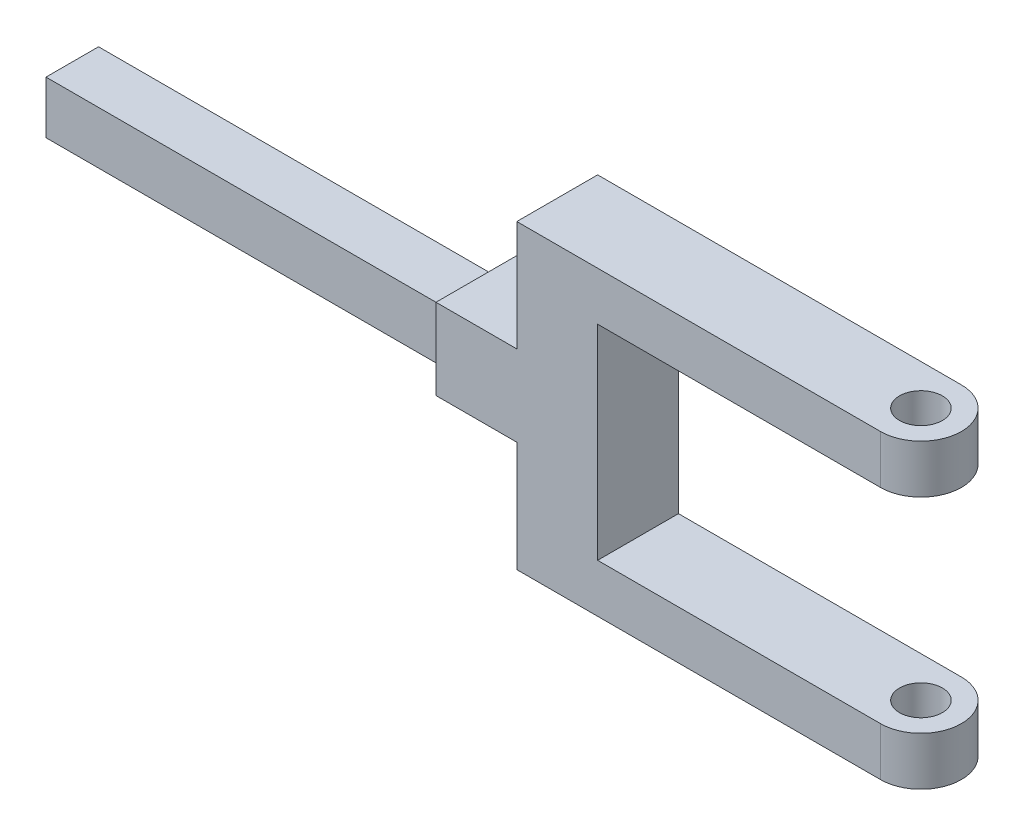
ISO-10303-21;
HEADER;
FILE_DESCRIPTION(('STEP AP214'),'2;1');
FILE_NAME('part.step','',(''),(''),'','','');
FILE_SCHEMA(('AUTOMOTIVE_DESIGN { 1 0 10303 214 1 1 1 1 }'));
ENDSEC;
DATA;
#1=APPLICATION_CONTEXT('core data for automotive mechanical design processes');
#2=APPLICATION_PROTOCOL_DEFINITION('international standard','automotive_design',2000,#1);
#3=PRODUCT_CONTEXT('',#1,'mechanical');
#4=PRODUCT('Part','Part','',(#3));
#5=PRODUCT_RELATED_PRODUCT_CATEGORY('part','',(#4));
#6=PRODUCT_DEFINITION_FORMATION('','',#4);
#7=PRODUCT_DEFINITION_CONTEXT('part definition',#1,'design');
#8=PRODUCT_DEFINITION('design','',#6,#7);
#9=PRODUCT_DEFINITION_SHAPE('','',#8);
#10=(LENGTH_UNIT() NAMED_UNIT(*) SI_UNIT(.MILLI.,.METRE.));
#11=(NAMED_UNIT(*) PLANE_ANGLE_UNIT() SI_UNIT($,.RADIAN.));
#12=(NAMED_UNIT(*) SI_UNIT($,.STERADIAN.) SOLID_ANGLE_UNIT());
#13=UNCERTAINTY_MEASURE_WITH_UNIT(LENGTH_MEASURE(1.E-05),#10,'distance_accuracy_value','');
#14=(GEOMETRIC_REPRESENTATION_CONTEXT(3) GLOBAL_UNCERTAINTY_ASSIGNED_CONTEXT((#13)) GLOBAL_UNIT_ASSIGNED_CONTEXT((#10,
#11,#12)) REPRESENTATION_CONTEXT('',''));
#15=CARTESIAN_POINT('',(0.,0.,0.));
#16=DIRECTION('',(0.,0.,1.));
#17=DIRECTION('',(1.,0.,0.));
#18=AXIS2_PLACEMENT_3D('',#15,#16,#17);
#19=CARTESIAN_POINT('',(40.,18.65,10.));
#20=DIRECTION('',(0.,-1.,0.));
#21=DIRECTION('',(1.,0.,0.));
#22=AXIS2_PLACEMENT_3D('',#19,#20,#21);
#23=PLANE('',#22);
#24=CARTESIAN_POINT('',(35.,18.65,5.));
#25=DIRECTION('',(0.,1.,0.));
#26=DIRECTION('',(-1.,0.,0.));
#27=AXIS2_PLACEMENT_3D('',#24,#25,#26);
#28=CIRCLE('',#27,2.65);
#29=CARTESIAN_POINT('',(32.35,18.65,5.));
#30=VERTEX_POINT('',#29);
#31=EDGE_CURVE('E349',#30,#30,#28,.T.);
#32=ORIENTED_EDGE('',*,*,#31,.F.);
#33=EDGE_LOOP('',(#32));
#34=FACE_BOUND('',#33,.T.);
#35=DIRECTION('',(-1.,0.,0.));
#36=VECTOR('',#35,1.);
#37=CARTESIAN_POINT('',(40.,18.65,10.));
#38=LINE('',#37,#36);
#39=CARTESIAN_POINT('',(35.,18.65,10.));
#40=VERTEX_POINT('',#39);
#41=CARTESIAN_POINT('',(-10.,18.65,10.));
#42=VERTEX_POINT('',#41);
#43=EDGE_CURVE('E240',#40,#42,#38,.T.);
#44=ORIENTED_EDGE('',*,*,#43,.F.);
#45=CARTESIAN_POINT('',(35.,18.65,5.));
#46=DIRECTION('',(0.,1.,0.));
#47=DIRECTION('',(-1.,0.,0.));
#48=AXIS2_PLACEMENT_3D('',#45,#46,#47);
#49=CIRCLE('',#48,5.);
#50=CARTESIAN_POINT('',(35.,18.65,0.));
#51=VERTEX_POINT('',#50);
#52=EDGE_CURVE('E198',#40,#51,#49,.T.);
#53=ORIENTED_EDGE('',*,*,#52,.T.);
#54=DIRECTION('',(-1.,0.,0.));
#55=VECTOR('',#54,1.);
#56=CARTESIAN_POINT('',(40.,18.65,0.));
#57=LINE('',#56,#55);
#58=CARTESIAN_POINT('',(-10.,18.65,0.));
#59=VERTEX_POINT('',#58);
#60=EDGE_CURVE('E226',#51,#59,#57,.T.);
#61=ORIENTED_EDGE('',*,*,#60,.T.);
#62=DIRECTION('',(0.,0.,-1.));
#63=VECTOR('',#62,1.);
#64=CARTESIAN_POINT('',(-10.,18.65,10.));
#65=LINE('',#64,#63);
#66=EDGE_CURVE('E248',#42,#59,#65,.T.);
#67=ORIENTED_EDGE('',*,*,#66,.F.);
#68=EDGE_LOOP('',(#44,#53,#61,#67));
#69=FACE_BOUND('',#68,.T.);
#70=ADVANCED_FACE('F79',(#34,#69),#23,.F.);
#71=CARTESIAN_POINT('',(-10.,-18.65,10.));
#72=DIRECTION('',(0.,1.,0.));
#73=DIRECTION('',(-1.,0.,0.));
#74=AXIS2_PLACEMENT_3D('',#71,#72,#73);
#75=PLANE('',#74);
#76=CARTESIAN_POINT('',(35.,-18.65,5.));
#77=DIRECTION('',(0.,1.,0.));
#78=DIRECTION('',(-1.,0.,0.));
#79=AXIS2_PLACEMENT_3D('',#76,#77,#78);
#80=CIRCLE('',#79,2.65);
#81=CARTESIAN_POINT('',(32.35,-18.65,5.));
#82=VERTEX_POINT('',#81);
#83=EDGE_CURVE('E260',#82,#82,#80,.T.);
#84=ORIENTED_EDGE('',*,*,#83,.T.);
#85=EDGE_LOOP('',(#84));
#86=FACE_BOUND('',#85,.T.);
#87=CARTESIAN_POINT('',(35.,-18.65,5.));
#88=DIRECTION('',(0.,1.,0.));
#89=DIRECTION('',(-1.,0.,0.));
#90=AXIS2_PLACEMENT_3D('',#87,#88,#89);
#91=CIRCLE('',#90,5.);
#92=CARTESIAN_POINT('',(35.,-18.65,10.));
#93=VERTEX_POINT('',#92);
#94=CARTESIAN_POINT('',(35.,-18.65,0.));
#95=VERTEX_POINT('',#94);
#96=EDGE_CURVE('E93',#93,#95,#91,.T.);
#97=ORIENTED_EDGE('',*,*,#96,.F.);
#98=DIRECTION('',(1.,0.,0.));
#99=VECTOR('',#98,1.);
#100=CARTESIAN_POINT('',(-10.,-18.65,10.));
#101=LINE('',#100,#99);
#102=CARTESIAN_POINT('',(-10.,-18.65,10.));
#103=VERTEX_POINT('',#102);
#104=EDGE_CURVE('E194',#103,#93,#101,.T.);
#105=ORIENTED_EDGE('',*,*,#104,.F.);
#106=DIRECTION('',(0.,0.,-1.));
#107=VECTOR('',#106,1.);
#108=CARTESIAN_POINT('',(-10.,-18.65,10.));
#109=LINE('',#108,#107);
#110=CARTESIAN_POINT('',(-10.,-18.65,0.));
#111=VERTEX_POINT('',#110);
#112=EDGE_CURVE('E246',#103,#111,#109,.T.);
#113=ORIENTED_EDGE('',*,*,#112,.T.);
#114=DIRECTION('',(1.,0.,0.));
#115=VECTOR('',#114,1.);
#116=CARTESIAN_POINT('',(-10.,-18.65,0.));
#117=LINE('',#116,#115);
#118=EDGE_CURVE('E196',#111,#95,#117,.T.);
#119=ORIENTED_EDGE('',*,*,#118,.T.);
#120=EDGE_LOOP('',(#97,#105,#113,#119));
#121=FACE_BOUND('',#120,.T.);
#122=ADVANCED_FACE('F191',(#86,#121),#75,.F.);
#123=CARTESIAN_POINT('',(40.,-12.65,10.));
#124=DIRECTION('',(0.,-1.,0.));
#125=DIRECTION('',(1.,0.,0.));
#126=AXIS2_PLACEMENT_3D('',#123,#124,#125);
#127=PLANE('',#126);
#128=CARTESIAN_POINT('',(35.,-12.65,5.));
#129=DIRECTION('',(0.,-1.,0.));
#130=DIRECTION('',(1.,0.,0.));
#131=AXIS2_PLACEMENT_3D('',#128,#129,#130);
#132=CIRCLE('',#131,2.65);
#133=CARTESIAN_POINT('',(37.65,-12.65,5.));
#134=VERTEX_POINT('',#133);
#135=EDGE_CURVE('E253',#134,#134,#132,.T.);
#136=ORIENTED_EDGE('',*,*,#135,.T.);
#137=EDGE_LOOP('',(#136));
#138=FACE_BOUND('',#137,.T.);
#139=DIRECTION('',(-1.,0.,0.));
#140=VECTOR('',#139,1.);
#141=CARTESIAN_POINT('',(40.,-12.65,10.));
#142=LINE('',#141,#140);
#143=CARTESIAN_POINT('',(35.,-12.65,10.));
#144=VERTEX_POINT('',#143);
#145=CARTESIAN_POINT('',(0.,-12.65,10.));
#146=VERTEX_POINT('',#145);
#147=EDGE_CURVE('E212',#144,#146,#142,.T.);
#148=ORIENTED_EDGE('',*,*,#147,.F.);
#149=CARTESIAN_POINT('',(35.,-12.65,5.));
#150=DIRECTION('',(0.,-1.,0.));
#151=DIRECTION('',(1.,0.,0.));
#152=AXIS2_PLACEMENT_3D('',#149,#150,#151);
#153=CIRCLE('',#152,5.);
#154=CARTESIAN_POINT('',(35.,-12.65,0.));
#155=VERTEX_POINT('',#154);
#156=EDGE_CURVE('E204',#155,#144,#153,.T.);
#157=ORIENTED_EDGE('',*,*,#156,.F.);
#158=DIRECTION('',(-1.,0.,0.));
#159=VECTOR('',#158,1.);
#160=CARTESIAN_POINT('',(40.,-12.65,0.));
#161=LINE('',#160,#159);
#162=CARTESIAN_POINT('',(0.,-12.65,0.));
#163=VERTEX_POINT('',#162);
#164=EDGE_CURVE('E233',#155,#163,#161,.T.);
#165=ORIENTED_EDGE('',*,*,#164,.T.);
#166=DIRECTION('',(0.,0.,-1.));
#167=VECTOR('',#166,1.);
#168=CARTESIAN_POINT('',(0.,-12.65,10.));
#169=LINE('',#168,#167);
#170=EDGE_CURVE('E243',#146,#163,#169,.T.);
#171=ORIENTED_EDGE('',*,*,#170,.F.);
#172=EDGE_LOOP('',(#148,#157,#165,#171));
#173=FACE_BOUND('',#172,.T.);
#174=ADVANCED_FACE('F365',(#138,#173),#127,.F.);
#175=CARTESIAN_POINT('',(0.,12.65,10.));
#176=DIRECTION('',(0.,1.,0.));
#177=DIRECTION('',(0.,0.,1.));
#178=AXIS2_PLACEMENT_3D('',#175,#176,#177);
#179=PLANE('',#178);
#180=CARTESIAN_POINT('',(35.,12.65,5.));
#181=DIRECTION('',(0.,1.,0.));
#182=DIRECTION('',(0.,0.,1.));
#183=AXIS2_PLACEMENT_3D('',#180,#181,#182);
#184=CIRCLE('',#183,2.65);
#185=CARTESIAN_POINT('',(35.,12.65,7.65));
#186=VERTEX_POINT('',#185);
#187=EDGE_CURVE('E251',#186,#186,#184,.T.);
#188=ORIENTED_EDGE('',*,*,#187,.T.);
#189=EDGE_LOOP('',(#188));
#190=FACE_BOUND('',#189,.T.);
#191=CARTESIAN_POINT('',(35.,12.65,5.));
#192=DIRECTION('',(0.,1.,0.));
#193=DIRECTION('',(0.,0.,1.));
#194=AXIS2_PLACEMENT_3D('',#191,#192,#193);
#195=CIRCLE('',#194,5.);
#196=CARTESIAN_POINT('',(35.,12.65,10.));
#197=VERTEX_POINT('',#196);
#198=CARTESIAN_POINT('',(35.,12.65,0.));
#199=VERTEX_POINT('',#198);
#200=EDGE_CURVE('E101',#197,#199,#195,.T.);
#201=ORIENTED_EDGE('',*,*,#200,.F.);
#202=DIRECTION('',(1.,0.,0.));
#203=VECTOR('',#202,1.);
#204=CARTESIAN_POINT('',(0.,12.65,10.));
#205=LINE('',#204,#203);
#206=CARTESIAN_POINT('',(0.,12.65,10.));
#207=VERTEX_POINT('',#206);
#208=EDGE_CURVE('E222',#207,#197,#205,.T.);
#209=ORIENTED_EDGE('',*,*,#208,.F.);
#210=DIRECTION('',(0.,0.,-1.));
#211=VECTOR('',#210,1.);
#212=CARTESIAN_POINT('',(0.,12.65,10.));
#213=LINE('',#212,#211);
#214=CARTESIAN_POINT('',(0.,12.65,0.));
#215=VERTEX_POINT('',#214);
#216=EDGE_CURVE('E225',#207,#215,#213,.T.);
#217=ORIENTED_EDGE('',*,*,#216,.T.);
#218=DIRECTION('',(1.,0.,0.));
#219=VECTOR('',#218,1.);
#220=CARTESIAN_POINT('',(0.,12.65,0.));
#221=LINE('',#220,#219);
#222=EDGE_CURVE('E237',#215,#199,#221,.T.);
#223=ORIENTED_EDGE('',*,*,#222,.T.);
#224=EDGE_LOOP('',(#201,#209,#217,#223));
#225=FACE_BOUND('',#224,.T.);
#226=ADVANCED_FACE('F368',(#190,#225),#179,.F.);
#227=CARTESIAN_POINT('',(0.,0.,10.));
#228=DIRECTION('',(0.,0.,1.));
#229=DIRECTION('',(1.,0.,0.));
#230=AXIS2_PLACEMENT_3D('',#227,#228,#229);
#231=PLANE('',#230);
#232=ORIENTED_EDGE('',*,*,#104,.T.);
#233=DIRECTION('',(0.,1.,0.));
#234=VECTOR('',#233,1.);
#235=CARTESIAN_POINT('',(35.,-18.65,10.));
#236=LINE('',#235,#234);
#237=EDGE_CURVE('E201',#93,#144,#236,.T.);
#238=ORIENTED_EDGE('',*,*,#237,.T.);
#239=ORIENTED_EDGE('',*,*,#147,.T.);
#240=DIRECTION('',(0.,1.,0.));
#241=VECTOR('',#240,1.);
#242=CARTESIAN_POINT('',(0.,12.65,10.));
#243=LINE('',#242,#241);
#244=EDGE_CURVE('E215',#146,#207,#243,.T.);
#245=ORIENTED_EDGE('',*,*,#244,.T.);
#246=ORIENTED_EDGE('',*,*,#208,.T.);
#247=DIRECTION('',(0.,1.,0.));
#248=VECTOR('',#247,1.);
#249=CARTESIAN_POINT('',(35.,-18.65,10.));
#250=LINE('',#249,#248);
#251=EDGE_CURVE('E12',#197,#40,#250,.T.);
#252=ORIENTED_EDGE('',*,*,#251,.T.);
#253=ORIENTED_EDGE('',*,*,#43,.T.);
#254=DIRECTION('',(0.,-1.,0.));
#255=VECTOR('',#254,1.);
#256=CARTESIAN_POINT('',(-10.,18.65,10.));
#257=LINE('',#256,#255);
#258=CARTESIAN_POINT('',(-10.,5.,10.));
#259=VERTEX_POINT('',#258);
#260=EDGE_CURVE('E213',#42,#259,#257,.T.);
#261=ORIENTED_EDGE('',*,*,#260,.T.);
#262=DIRECTION('',(1.,0.,0.));
#263=VECTOR('',#262,1.);
#264=CARTESIAN_POINT('',(-20.,5.,10.));
#265=LINE('',#264,#263);
#266=CARTESIAN_POINT('',(-20.,5.,10.));
#267=VERTEX_POINT('',#266);
#268=EDGE_CURVE('E313',#267,#259,#265,.T.);
#269=ORIENTED_EDGE('',*,*,#268,.F.);
#270=DIRECTION('',(0.,1.,0.));
#271=VECTOR('',#270,1.);
#272=CARTESIAN_POINT('',(-20.,0.,10.));
#273=LINE('',#272,#271);
#274=CARTESIAN_POINT('',(-20.,-5.,10.));
#275=VERTEX_POINT('',#274);
#276=EDGE_CURVE('E302',#275,#267,#273,.T.);
#277=ORIENTED_EDGE('',*,*,#276,.F.);
#278=DIRECTION('',(1.,0.,0.));
#279=VECTOR('',#278,1.);
#280=CARTESIAN_POINT('',(-20.,-5.,10.));
#281=LINE('',#280,#279);
#282=CARTESIAN_POINT('',(-10.,-5.,10.));
#283=VERTEX_POINT('',#282);
#284=EDGE_CURVE('E316',#275,#283,#281,.T.);
#285=ORIENTED_EDGE('',*,*,#284,.T.);
#286=EDGE_CURVE('E210',#283,#103,#257,.T.);
#287=ORIENTED_EDGE('',*,*,#286,.T.);
#288=EDGE_LOOP('',(#232,#238,#239,#245,#246,#252,#253,#261,#269,#277,#285,#287));
#289=FACE_BOUND('',#288,.T.);
#290=ADVANCED_FACE('F208',(#289),#231,.T.);
#291=CARTESIAN_POINT('',(0.,0.,0.));
#292=DIRECTION('',(0.,0.,1.));
#293=DIRECTION('',(1.,0.,0.));
#294=AXIS2_PLACEMENT_3D('',#291,#292,#293);
#295=PLANE('',#294);
#296=DIRECTION('',(0.,1.,0.));
#297=VECTOR('',#296,1.);
#298=CARTESIAN_POINT('',(35.,-18.65,0.));
#299=LINE('',#298,#297);
#300=EDGE_CURVE('E197',#95,#155,#299,.T.);
#301=ORIENTED_EDGE('',*,*,#300,.F.);
#302=ORIENTED_EDGE('',*,*,#118,.F.);
#303=DIRECTION('',(0.,-1.,0.));
#304=VECTOR('',#303,1.);
#305=CARTESIAN_POINT('',(-10.,18.65,0.));
#306=LINE('',#305,#304);
#307=CARTESIAN_POINT('',(-10.,-5.,0.));
#308=VERTEX_POINT('',#307);
#309=EDGE_CURVE('E228',#308,#111,#306,.T.);
#310=ORIENTED_EDGE('',*,*,#309,.F.);
#311=DIRECTION('',(1.,0.,0.));
#312=VECTOR('',#311,1.);
#313=CARTESIAN_POINT('',(-20.,-5.,0.));
#314=LINE('',#313,#312);
#315=CARTESIAN_POINT('',(-20.,-5.,0.));
#316=VERTEX_POINT('',#315);
#317=EDGE_CURVE('E229',#316,#308,#314,.T.);
#318=ORIENTED_EDGE('',*,*,#317,.F.);
#319=DIRECTION('',(0.,-1.,0.));
#320=VECTOR('',#319,1.);
#321=CARTESIAN_POINT('',(-20.,0.,0.));
#322=LINE('',#321,#320);
#323=CARTESIAN_POINT('',(-20.,5.,0.));
#324=VERTEX_POINT('',#323);
#325=EDGE_CURVE('E296',#324,#316,#322,.T.);
#326=ORIENTED_EDGE('',*,*,#325,.F.);
#327=DIRECTION('',(1.,0.,0.));
#328=VECTOR('',#327,1.);
#329=CARTESIAN_POINT('',(-20.,5.,0.));
#330=LINE('',#329,#328);
#331=CARTESIAN_POINT('',(-10.,5.,0.));
#332=VERTEX_POINT('',#331);
#333=EDGE_CURVE('E307',#324,#332,#330,.T.);
#334=ORIENTED_EDGE('',*,*,#333,.T.);
#335=EDGE_CURVE('E230',#59,#332,#306,.T.);
#336=ORIENTED_EDGE('',*,*,#335,.F.);
#337=ORIENTED_EDGE('',*,*,#60,.F.);
#338=DIRECTION('',(0.,1.,0.));
#339=VECTOR('',#338,1.);
#340=CARTESIAN_POINT('',(35.,-18.65,0.));
#341=LINE('',#340,#339);
#342=EDGE_CURVE('E86',#199,#51,#341,.T.);
#343=ORIENTED_EDGE('',*,*,#342,.F.);
#344=ORIENTED_EDGE('',*,*,#222,.F.);
#345=DIRECTION('',(0.,1.,0.));
#346=VECTOR('',#345,1.);
#347=CARTESIAN_POINT('',(0.,12.65,0.));
#348=LINE('',#347,#346);
#349=EDGE_CURVE('E235',#163,#215,#348,.T.);
#350=ORIENTED_EDGE('',*,*,#349,.F.);
#351=ORIENTED_EDGE('',*,*,#164,.F.);
#352=EDGE_LOOP('',(#301,#302,#310,#318,#326,#334,#336,#337,#343,#344,#350,#351));
#353=FACE_BOUND('',#352,.T.);
#354=ADVANCED_FACE('F331',(#353),#295,.F.);
#355=CARTESIAN_POINT('',(-20.,0.,0.));
#356=DIRECTION('',(-1.,0.,0.));
#357=DIRECTION('',(0.,-1.,0.));
#358=AXIS2_PLACEMENT_3D('',#355,#356,#357);
#359=PLANE('',#358);
#360=ORIENTED_EDGE('',*,*,#325,.T.);
#361=DIRECTION('',(0.,0.,1.));
#362=VECTOR('',#361,1.);
#363=CARTESIAN_POINT('',(-20.,-5.,0.));
#364=LINE('',#363,#362);
#365=EDGE_CURVE('E299',#316,#275,#364,.T.);
#366=ORIENTED_EDGE('',*,*,#365,.T.);
#367=ORIENTED_EDGE('',*,*,#276,.T.);
#368=DIRECTION('',(0.,0.,1.));
#369=VECTOR('',#368,1.);
#370=CARTESIAN_POINT('',(-20.,5.,0.));
#371=LINE('',#370,#369);
#372=EDGE_CURVE('E304',#324,#267,#371,.T.);
#373=ORIENTED_EDGE('',*,*,#372,.F.);
#374=EDGE_LOOP('',(#360,#366,#367,#373));
#375=FACE_BOUND('',#374,.T.);
#376=DIRECTION('',(0.,1.,0.));
#377=VECTOR('',#376,1.);
#378=CARTESIAN_POINT('',(-20.,0.,8.25));
#379=LINE('',#378,#377);
#380=CARTESIAN_POINT('',(-20.,-3.25,8.25));
#381=VERTEX_POINT('',#380);
#382=CARTESIAN_POINT('',(-20.,3.25,8.25));
#383=VERTEX_POINT('',#382);
#384=EDGE_CURVE('E268',#381,#383,#379,.T.);
#385=ORIENTED_EDGE('',*,*,#384,.F.);
#386=DIRECTION('',(0.,0.,-1.));
#387=VECTOR('',#386,1.);
#388=CARTESIAN_POINT('',(-20.,-3.25000000000001,0.));
#389=LINE('',#388,#387);
#390=CARTESIAN_POINT('',(-20.,-3.25000000000001,1.75));
#391=VERTEX_POINT('',#390);
#392=EDGE_CURVE('E257',#381,#391,#389,.T.);
#393=ORIENTED_EDGE('',*,*,#392,.T.);
#394=DIRECTION('',(0.,1.,0.));
#395=VECTOR('',#394,1.);
#396=CARTESIAN_POINT('',(-20.,0.,1.75));
#397=LINE('',#396,#395);
#398=CARTESIAN_POINT('',(-20.,3.25,1.75));
#399=VERTEX_POINT('',#398);
#400=EDGE_CURVE('E277',#391,#399,#397,.T.);
#401=ORIENTED_EDGE('',*,*,#400,.T.);
#402=DIRECTION('',(0.,0.,-1.));
#403=VECTOR('',#402,1.);
#404=CARTESIAN_POINT('',(-20.,3.25,0.));
#405=LINE('',#404,#403);
#406=EDGE_CURVE('E279',#383,#399,#405,.T.);
#407=ORIENTED_EDGE('',*,*,#406,.F.);
#408=EDGE_LOOP('',(#385,#393,#401,#407));
#409=FACE_BOUND('',#408,.T.);
#410=ADVANCED_FACE('F340',(#375,#409),#359,.T.);
#411=CARTESIAN_POINT('',(-10.,18.65,10.));
#412=DIRECTION('',(1.,0.,0.));
#413=DIRECTION('',(0.,1.,0.));
#414=AXIS2_PLACEMENT_3D('',#411,#412,#413);
#415=PLANE('',#414);
#416=DIRECTION('',(0.,0.,1.));
#417=VECTOR('',#416,1.);
#418=CARTESIAN_POINT('',(-10.,-5.,0.));
#419=LINE('',#418,#417);
#420=EDGE_CURVE('E287',#308,#283,#419,.T.);
#421=ORIENTED_EDGE('',*,*,#420,.F.);
#422=ORIENTED_EDGE('',*,*,#309,.T.);
#423=ORIENTED_EDGE('',*,*,#112,.F.);
#424=ORIENTED_EDGE('',*,*,#286,.F.);
#425=EDGE_LOOP('',(#421,#422,#423,#424));
#426=FACE_BOUND('',#425,.T.);
#427=ADVANCED_FACE('F346',(#426),#415,.F.);
#428=ORIENTED_EDGE('',*,*,#335,.T.);
#429=DIRECTION('',(0.,0.,1.));
#430=VECTOR('',#429,1.);
#431=CARTESIAN_POINT('',(-10.,5.,0.));
#432=LINE('',#431,#430);
#433=EDGE_CURVE('E300',#332,#259,#432,.T.);
#434=ORIENTED_EDGE('',*,*,#433,.T.);
#435=ORIENTED_EDGE('',*,*,#260,.F.);
#436=ORIENTED_EDGE('',*,*,#66,.T.);
#437=EDGE_LOOP('',(#428,#434,#435,#436));
#438=FACE_BOUND('',#437,.T.);
#439=ADVANCED_FACE('F326',(#438),#415,.F.);
#440=CARTESIAN_POINT('',(0.,12.65,10.));
#441=DIRECTION('',(-1.,0.,0.));
#442=DIRECTION('',(0.,0.,1.));
#443=AXIS2_PLACEMENT_3D('',#440,#441,#442);
#444=PLANE('',#443);
#445=ORIENTED_EDGE('',*,*,#349,.T.);
#446=ORIENTED_EDGE('',*,*,#216,.F.);
#447=ORIENTED_EDGE('',*,*,#244,.F.);
#448=ORIENTED_EDGE('',*,*,#170,.T.);
#449=EDGE_LOOP('',(#445,#446,#447,#448));
#450=FACE_BOUND('',#449,.T.);
#451=ADVANCED_FACE('F375',(#450),#444,.F.);
#452=CARTESIAN_POINT('',(-20.,-5.,0.));
#453=DIRECTION('',(0.,1.,0.));
#454=DIRECTION('',(-1.,0.,0.));
#455=AXIS2_PLACEMENT_3D('',#452,#453,#454);
#456=PLANE('',#455);
#457=ORIENTED_EDGE('',*,*,#420,.T.);
#458=ORIENTED_EDGE('',*,*,#284,.F.);
#459=ORIENTED_EDGE('',*,*,#365,.F.);
#460=ORIENTED_EDGE('',*,*,#317,.T.);
#461=EDGE_LOOP('',(#457,#458,#459,#460));
#462=FACE_BOUND('',#461,.T.);
#463=ADVANCED_FACE('F343',(#462),#456,.F.);
#464=CARTESIAN_POINT('',(-20.,5.,0.));
#465=DIRECTION('',(0.,1.,0.));
#466=DIRECTION('',(-1.,0.,0.));
#467=AXIS2_PLACEMENT_3D('',#464,#465,#466);
#468=PLANE('',#467);
#469=ORIENTED_EDGE('',*,*,#433,.F.);
#470=ORIENTED_EDGE('',*,*,#333,.F.);
#471=ORIENTED_EDGE('',*,*,#372,.T.);
#472=ORIENTED_EDGE('',*,*,#268,.T.);
#473=EDGE_LOOP('',(#469,#470,#471,#472));
#474=FACE_BOUND('',#473,.T.);
#475=ADVANCED_FACE('F336',(#474),#468,.T.);
#476=CARTESIAN_POINT('',(-70.,-3.25000000000001,0.));
#477=DIRECTION('',(0.,-1.,0.));
#478=DIRECTION('',(1.,0.,0.));
#479=AXIS2_PLACEMENT_3D('',#476,#477,#478);
#480=PLANE('',#479);
#481=ORIENTED_EDGE('',*,*,#392,.F.);
#482=DIRECTION('',(1.,0.,0.));
#483=VECTOR('',#482,1.);
#484=CARTESIAN_POINT('',(-70.,-3.25000000000001,8.25));
#485=LINE('',#484,#483);
#486=CARTESIAN_POINT('',(-70.,-3.25000000000001,8.25));
#487=VERTEX_POINT('',#486);
#488=EDGE_CURVE('E284',#487,#381,#485,.T.);
#489=ORIENTED_EDGE('',*,*,#488,.F.);
#490=DIRECTION('',(0.,0.,-1.));
#491=VECTOR('',#490,1.);
#492=CARTESIAN_POINT('',(-70.,-3.25000000000001,0.));
#493=LINE('',#492,#491);
#494=CARTESIAN_POINT('',(-70.,-3.25000000000001,1.75));
#495=VERTEX_POINT('',#494);
#496=EDGE_CURVE('E264',#487,#495,#493,.T.);
#497=ORIENTED_EDGE('',*,*,#496,.T.);
#498=DIRECTION('',(1.,0.,0.));
#499=VECTOR('',#498,1.);
#500=CARTESIAN_POINT('',(-70.,-3.25000000000001,1.75));
#501=LINE('',#500,#499);
#502=EDGE_CURVE('E275',#495,#391,#501,.T.);
#503=ORIENTED_EDGE('',*,*,#502,.T.);
#504=EDGE_LOOP('',(#481,#489,#497,#503));
#505=FACE_BOUND('',#504,.T.);
#506=ADVANCED_FACE('F406',(#505),#480,.T.);
#507=CARTESIAN_POINT('',(-70.,0.,8.25));
#508=DIRECTION('',(0.,0.,-1.));
#509=DIRECTION('',(-1.,0.,0.));
#510=AXIS2_PLACEMENT_3D('',#507,#508,#509);
#511=PLANE('',#510);
#512=ORIENTED_EDGE('',*,*,#384,.T.);
#513=DIRECTION('',(1.,0.,0.));
#514=VECTOR('',#513,1.);
#515=CARTESIAN_POINT('',(-70.,3.24999999999999,8.25));
#516=LINE('',#515,#514);
#517=CARTESIAN_POINT('',(-70.,3.24999999999999,8.25));
#518=VERTEX_POINT('',#517);
#519=EDGE_CURVE('E288',#518,#383,#516,.T.);
#520=ORIENTED_EDGE('',*,*,#519,.F.);
#521=DIRECTION('',(0.,1.,0.));
#522=VECTOR('',#521,1.);
#523=CARTESIAN_POINT('',(-70.,0.,8.25));
#524=LINE('',#523,#522);
#525=EDGE_CURVE('E273',#487,#518,#524,.T.);
#526=ORIENTED_EDGE('',*,*,#525,.F.);
#527=ORIENTED_EDGE('',*,*,#488,.T.);
#528=EDGE_LOOP('',(#512,#520,#526,#527));
#529=FACE_BOUND('',#528,.T.);
#530=ADVANCED_FACE('F402',(#529),#511,.F.);
#531=CARTESIAN_POINT('',(-70.,3.24999999999999,0.));
#532=DIRECTION('',(0.,-1.,0.));
#533=DIRECTION('',(1.,0.,0.));
#534=AXIS2_PLACEMENT_3D('',#531,#532,#533);
#535=PLANE('',#534);
#536=ORIENTED_EDGE('',*,*,#406,.T.);
#537=DIRECTION('',(1.,0.,0.));
#538=VECTOR('',#537,1.);
#539=CARTESIAN_POINT('',(-70.,3.24999999999999,1.75));
#540=LINE('',#539,#538);
#541=CARTESIAN_POINT('',(-70.,3.24999999999999,1.75));
#542=VERTEX_POINT('',#541);
#543=EDGE_CURVE('E291',#542,#399,#540,.T.);
#544=ORIENTED_EDGE('',*,*,#543,.F.);
#545=DIRECTION('',(0.,0.,-1.));
#546=VECTOR('',#545,1.);
#547=CARTESIAN_POINT('',(-70.,3.24999999999999,0.));
#548=LINE('',#547,#546);
#549=EDGE_CURVE('E271',#518,#542,#548,.T.);
#550=ORIENTED_EDGE('',*,*,#549,.F.);
#551=ORIENTED_EDGE('',*,*,#519,.T.);
#552=EDGE_LOOP('',(#536,#544,#550,#551));
#553=FACE_BOUND('',#552,.T.);
#554=ADVANCED_FACE('F405',(#553),#535,.F.);
#555=CARTESIAN_POINT('',(-70.,0.,1.75));
#556=DIRECTION('',(0.,0.,-1.));
#557=DIRECTION('',(-1.,0.,0.));
#558=AXIS2_PLACEMENT_3D('',#555,#556,#557);
#559=PLANE('',#558);
#560=ORIENTED_EDGE('',*,*,#400,.F.);
#561=ORIENTED_EDGE('',*,*,#502,.F.);
#562=DIRECTION('',(0.,1.,0.));
#563=VECTOR('',#562,1.);
#564=CARTESIAN_POINT('',(-70.,0.,1.75));
#565=LINE('',#564,#563);
#566=EDGE_CURVE('E267',#495,#542,#565,.T.);
#567=ORIENTED_EDGE('',*,*,#566,.T.);
#568=ORIENTED_EDGE('',*,*,#543,.T.);
#569=EDGE_LOOP('',(#560,#561,#567,#568));
#570=FACE_BOUND('',#569,.T.);
#571=ADVANCED_FACE('F386',(#570),#559,.T.);
#572=CARTESIAN_POINT('',(-70.,0.,0.));
#573=DIRECTION('',(1.,0.,0.));
#574=DIRECTION('',(0.,1.,0.));
#575=AXIS2_PLACEMENT_3D('',#572,#573,#574);
#576=PLANE('',#575);
#577=ORIENTED_EDGE('',*,*,#496,.F.);
#578=ORIENTED_EDGE('',*,*,#525,.T.);
#579=ORIENTED_EDGE('',*,*,#549,.T.);
#580=ORIENTED_EDGE('',*,*,#566,.F.);
#581=EDGE_LOOP('',(#577,#578,#579,#580));
#582=FACE_BOUND('',#581,.T.);
#583=ADVANCED_FACE('F380',(#582),#576,.F.);
#584=CARTESIAN_POINT('',(35.,-18.65,5.));
#585=DIRECTION('',(0.,1.,0.));
#586=DIRECTION('',(-1.,0.,0.));
#587=AXIS2_PLACEMENT_3D('',#584,#585,#586);
#588=CYLINDRICAL_SURFACE('',#587,5.);
#589=ORIENTED_EDGE('',*,*,#200,.T.);
#590=ORIENTED_EDGE('',*,*,#342,.T.);
#591=ORIENTED_EDGE('',*,*,#52,.F.);
#592=ORIENTED_EDGE('',*,*,#251,.F.);
#593=EDGE_LOOP('',(#589,#590,#591,#592));
#594=FACE_BOUND('',#593,.T.);
#595=ADVANCED_FACE('F378',(#594),#588,.T.);
#596=ORIENTED_EDGE('',*,*,#156,.T.);
#597=ORIENTED_EDGE('',*,*,#237,.F.);
#598=ORIENTED_EDGE('',*,*,#96,.T.);
#599=ORIENTED_EDGE('',*,*,#300,.T.);
#600=EDGE_LOOP('',(#596,#597,#598,#599));
#601=FACE_BOUND('',#600,.T.);
#602=ADVANCED_FACE('F202',(#601),#588,.T.);
#603=CARTESIAN_POINT('',(35.,-18.65,5.));
#604=DIRECTION('',(0.,1.,0.));
#605=DIRECTION('',(-1.,0.,0.));
#606=AXIS2_PLACEMENT_3D('',#603,#604,#605);
#607=CYLINDRICAL_SURFACE('',#606,2.65);
#608=ORIENTED_EDGE('',*,*,#31,.T.);
#609=EDGE_LOOP('',(#608));
#610=FACE_BOUND('',#609,.T.);
#611=ORIENTED_EDGE('',*,*,#187,.F.);
#612=EDGE_LOOP('',(#611));
#613=FACE_BOUND('',#612,.T.);
#614=ADVANCED_FACE('F361',(#610,#613),#607,.F.);
#615=ORIENTED_EDGE('',*,*,#83,.F.);
#616=EDGE_LOOP('',(#615));
#617=FACE_BOUND('',#616,.T.);
#618=ORIENTED_EDGE('',*,*,#135,.F.);
#619=EDGE_LOOP('',(#618));
#620=FACE_BOUND('',#619,.T.);
#621=ADVANCED_FACE('F358',(#617,#620),#607,.F.);
#622=CLOSED_SHELL('',(#70,#122,#174,#226,#290,#354,#410,#427,#439,#451,#463,#475,#506,#530,#554,
#571,#583,#595,#602,#614,#621));
#623=MANIFOLD_SOLID_BREP('B2',#622);
#624=ADVANCED_BREP_SHAPE_REPRESENTATION('',(#18,#623),#14);
#625=SHAPE_DEFINITION_REPRESENTATION(#9,#624);
ENDSEC;
END-ISO-10303-21;
